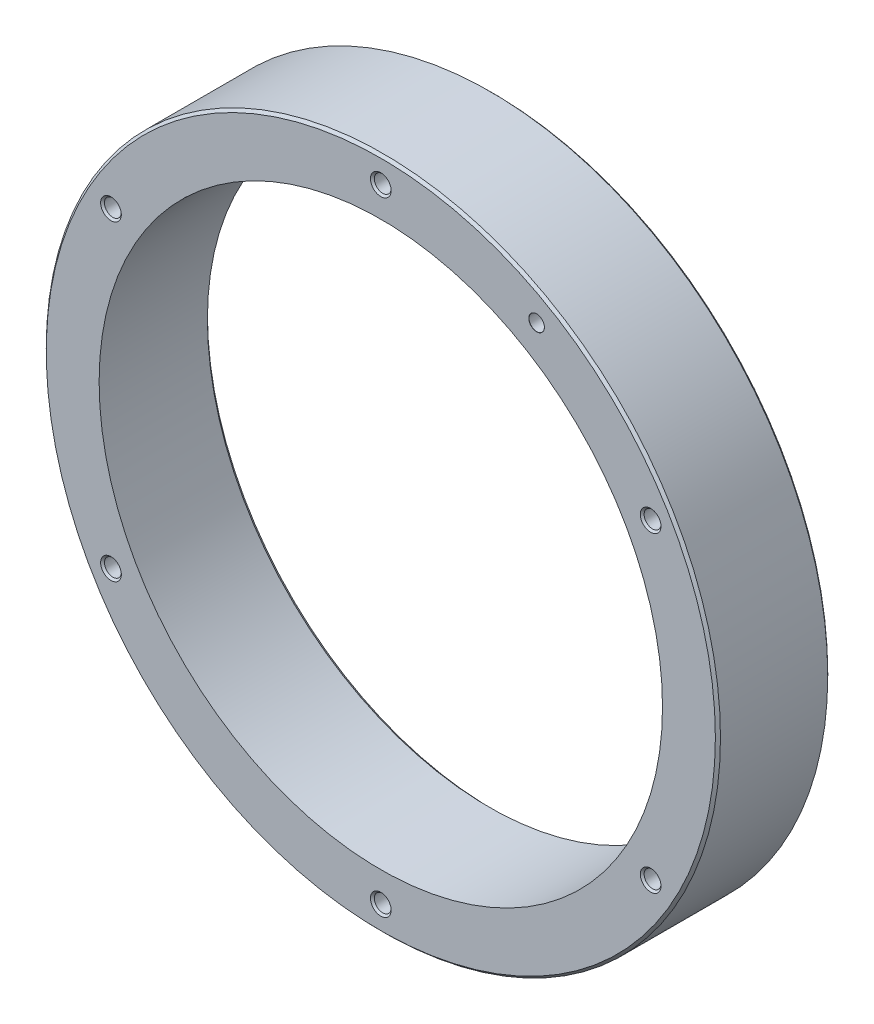
ISO-10303-21;
HEADER;
FILE_DESCRIPTION(('STEP AP214'),'2;1');
FILE_NAME('part.step','',(''),(''),'','','');
FILE_SCHEMA(('AUTOMOTIVE_DESIGN { 1 0 10303 214 1 1 1 1 }'));
ENDSEC;
DATA;
#1=APPLICATION_CONTEXT('core data for automotive mechanical design processes');
#2=APPLICATION_PROTOCOL_DEFINITION('international standard','automotive_design',2000,#1);
#3=PRODUCT_CONTEXT('',#1,'mechanical');
#4=PRODUCT('Part','Part','',(#3));
#5=PRODUCT_RELATED_PRODUCT_CATEGORY('part','',(#4));
#6=PRODUCT_DEFINITION_FORMATION('','',#4);
#7=PRODUCT_DEFINITION_CONTEXT('part definition',#1,'design');
#8=PRODUCT_DEFINITION('design','',#6,#7);
#9=PRODUCT_DEFINITION_SHAPE('','',#8);
#10=(LENGTH_UNIT() NAMED_UNIT(*) SI_UNIT(.MILLI.,.METRE.));
#11=(NAMED_UNIT(*) PLANE_ANGLE_UNIT() SI_UNIT($,.RADIAN.));
#12=(NAMED_UNIT(*) SI_UNIT($,.STERADIAN.) SOLID_ANGLE_UNIT());
#13=UNCERTAINTY_MEASURE_WITH_UNIT(LENGTH_MEASURE(1.E-05),#10,'distance_accuracy_value','');
#14=(GEOMETRIC_REPRESENTATION_CONTEXT(3) GLOBAL_UNCERTAINTY_ASSIGNED_CONTEXT((#13)) GLOBAL_UNIT_ASSIGNED_CONTEXT((#10,
#11,#12)) REPRESENTATION_CONTEXT('',''));
#15=CARTESIAN_POINT('',(0.,0.,0.));
#16=DIRECTION('',(0.,0.,1.));
#17=DIRECTION('',(1.,0.,0.));
#18=AXIS2_PLACEMENT_3D('',#15,#16,#17);
#19=CARTESIAN_POINT('',(0.,0.,-22.));
#20=DIRECTION('',(0.,0.,1.));
#21=DIRECTION('',(1.,0.,0.));
#22=AXIS2_PLACEMENT_3D('',#19,#20,#21);
#23=CYLINDRICAL_SURFACE('',#22,66.);
#24=CARTESIAN_POINT('',(0.,0.,-21.5));
#25=DIRECTION('',(0.,0.,1.));
#26=DIRECTION('',(1.,0.,0.));
#27=AXIS2_PLACEMENT_3D('',#24,#25,#26);
#28=CIRCLE('',#27,66.);
#29=CARTESIAN_POINT('',(66.,0.,-21.5));
#30=VERTEX_POINT('',#29);
#31=EDGE_CURVE('E153',#30,#30,#28,.T.);
#32=ORIENTED_EDGE('',*,*,#31,.T.);
#33=EDGE_LOOP('',(#32));
#34=FACE_BOUND('',#33,.T.);
#35=CARTESIAN_POINT('',(0.,0.,-0.500000000000056));
#36=DIRECTION('',(0.,0.,1.));
#37=DIRECTION('',(1.,0.,0.));
#38=AXIS2_PLACEMENT_3D('',#35,#36,#37);
#39=CIRCLE('',#38,66.);
#40=CARTESIAN_POINT('',(66.,0.,-0.500000000000056));
#41=VERTEX_POINT('',#40);
#42=EDGE_CURVE('E150',#41,#41,#39,.F.);
#43=ORIENTED_EDGE('',*,*,#42,.T.);
#44=EDGE_LOOP('',(#43));
#45=FACE_BOUND('',#44,.T.);
#46=ADVANCED_FACE('F45',(#34,#45),#23,.T.);
#47=CARTESIAN_POINT('',(0.,0.,-22.));
#48=DIRECTION('',(0.,0.,1.));
#49=DIRECTION('',(1.,0.,0.));
#50=AXIS2_PLACEMENT_3D('',#47,#48,#49);
#51=PLANE('',#50);
#52=CARTESIAN_POINT('',(0.,0.,-22.));
#53=DIRECTION('',(0.,0.,1.));
#54=DIRECTION('',(1.,0.,0.));
#55=AXIS2_PLACEMENT_3D('',#52,#53,#54);
#56=CIRCLE('',#55,55.95);
#57=CARTESIAN_POINT('',(55.95,0.,-22.));
#58=VERTEX_POINT('',#57);
#59=EDGE_CURVE('E54',#58,#58,#56,.T.);
#60=ORIENTED_EDGE('',*,*,#59,.T.);
#61=EDGE_LOOP('',(#60));
#62=FACE_BOUND('',#61,.T.);
#63=CARTESIAN_POINT('',(0.,0.,-22.));
#64=DIRECTION('',(0.,0.,1.));
#65=DIRECTION('',(1.,0.,0.));
#66=AXIS2_PLACEMENT_3D('',#63,#64,#65);
#67=CIRCLE('',#66,65.5);
#68=CARTESIAN_POINT('',(65.5,0.,-22.));
#69=VERTEX_POINT('',#68);
#70=EDGE_CURVE('E156',#69,#69,#67,.F.);
#71=ORIENTED_EDGE('',*,*,#70,.T.);
#72=EDGE_LOOP('',(#71));
#73=FACE_BOUND('',#72,.T.);
#74=ADVANCED_FACE('F164',(#62,#73),#51,.F.);
#75=CARTESIAN_POINT('',(0.,0.,0.));
#76=DIRECTION('',(0.,0.,1.));
#77=DIRECTION('',(1.,0.,0.));
#78=AXIS2_PLACEMENT_3D('',#75,#76,#77);
#79=PLANE('',#78);
#80=CARTESIAN_POINT('',(0.,0.,0.));
#81=DIRECTION('',(0.,0.,1.));
#82=DIRECTION('',(1.,0.,0.));
#83=AXIS2_PLACEMENT_3D('',#80,#81,#82);
#84=CIRCLE('',#83,65.4999999999999);
#85=CARTESIAN_POINT('',(65.4999999999999,0.,0.));
#86=VERTEX_POINT('',#85);
#87=EDGE_CURVE('E159',#86,#86,#84,.T.);
#88=ORIENTED_EDGE('',*,*,#87,.T.);
#89=EDGE_LOOP('',(#88));
#90=FACE_BOUND('',#89,.T.);
#91=CARTESIAN_POINT('',(30.5000000000001,52.8275496308507,0.));
#92=DIRECTION('',(0.,0.,1.));
#93=DIRECTION('',(1.,0.,0.));
#94=AXIS2_PLACEMENT_3D('',#91,#92,#93);
#95=CIRCLE('',#94,1.525);
#96=CARTESIAN_POINT('',(32.0250000000001,52.8275496308507,0.));
#97=VERTEX_POINT('',#96);
#98=EDGE_CURVE('E93',#97,#97,#95,.T.);
#99=ORIENTED_EDGE('',*,*,#98,.F.);
#100=EDGE_LOOP('',(#99));
#101=FACE_BOUND('',#100,.T.);
#102=CARTESIAN_POINT('',(52.8275496308504,30.5000000000006,0.));
#103=DIRECTION('',(0.,0.,1.));
#104=DIRECTION('',(1.,0.,0.));
#105=AXIS2_PLACEMENT_3D('',#102,#103,#104);
#106=CIRCLE('',#105,2.025);
#107=CARTESIAN_POINT('',(54.8525496308504,30.5000000000006,0.));
#108=VERTEX_POINT('',#107);
#109=EDGE_CURVE('E86',#108,#108,#106,.T.);
#110=ORIENTED_EDGE('',*,*,#109,.F.);
#111=EDGE_LOOP('',(#110));
#112=FACE_BOUND('',#111,.T.);
#113=CARTESIAN_POINT('',(52.827549630851,-30.4999999999995,0.));
#114=DIRECTION('',(0.,0.,1.));
#115=DIRECTION('',(1.,0.,0.));
#116=AXIS2_PLACEMENT_3D('',#113,#114,#115);
#117=CIRCLE('',#116,2.025);
#118=CARTESIAN_POINT('',(54.852549630851,-30.4999999999995,0.));
#119=VERTEX_POINT('',#118);
#120=EDGE_CURVE('E102',#119,#119,#117,.T.);
#121=ORIENTED_EDGE('',*,*,#120,.F.);
#122=EDGE_LOOP('',(#121));
#123=FACE_BOUND('',#122,.T.);
#124=CARTESIAN_POINT('',(0.,-61.,0.));
#125=DIRECTION('',(0.,0.,1.));
#126=DIRECTION('',(1.,0.,0.));
#127=AXIS2_PLACEMENT_3D('',#124,#125,#126);
#128=CIRCLE('',#127,2.025);
#129=CARTESIAN_POINT('',(2.025,-61.,0.));
#130=VERTEX_POINT('',#129);
#131=EDGE_CURVE('E111',#130,#130,#128,.T.);
#132=ORIENTED_EDGE('',*,*,#131,.F.);
#133=EDGE_LOOP('',(#132));
#134=FACE_BOUND('',#133,.T.);
#135=CARTESIAN_POINT('',(-52.8275496308506,-30.5000000000002,0.));
#136=DIRECTION('',(0.,0.,1.));
#137=DIRECTION('',(1.,0.,0.));
#138=AXIS2_PLACEMENT_3D('',#135,#136,#137);
#139=CIRCLE('',#138,2.025);
#140=CARTESIAN_POINT('',(-50.8025496308506,-30.5000000000002,0.));
#141=VERTEX_POINT('',#140);
#142=EDGE_CURVE('E120',#141,#141,#139,.T.);
#143=ORIENTED_EDGE('',*,*,#142,.F.);
#144=EDGE_LOOP('',(#143));
#145=FACE_BOUND('',#144,.T.);
#146=CARTESIAN_POINT('',(-52.8275496308508,30.4999999999999,0.));
#147=DIRECTION('',(0.,0.,1.));
#148=DIRECTION('',(1.,0.,0.));
#149=AXIS2_PLACEMENT_3D('',#146,#147,#148);
#150=CIRCLE('',#149,2.025);
#151=CARTESIAN_POINT('',(-50.8025496308508,30.4999999999999,0.));
#152=VERTEX_POINT('',#151);
#153=EDGE_CURVE('E129',#152,#152,#150,.T.);
#154=ORIENTED_EDGE('',*,*,#153,.F.);
#155=EDGE_LOOP('',(#154));
#156=FACE_BOUND('',#155,.T.);
#157=CARTESIAN_POINT('',(0.,61.,0.));
#158=DIRECTION('',(0.,0.,1.));
#159=DIRECTION('',(1.,0.,0.));
#160=AXIS2_PLACEMENT_3D('',#157,#158,#159);
#161=CIRCLE('',#160,2.025);
#162=CARTESIAN_POINT('',(2.025,61.,0.));
#163=VERTEX_POINT('',#162);
#164=EDGE_CURVE('E138',#163,#163,#161,.T.);
#165=ORIENTED_EDGE('',*,*,#164,.F.);
#166=EDGE_LOOP('',(#165));
#167=FACE_BOUND('',#166,.T.);
#168=CARTESIAN_POINT('',(0.,0.,0.));
#169=DIRECTION('',(0.,0.,1.));
#170=DIRECTION('',(1.,0.,0.));
#171=AXIS2_PLACEMENT_3D('',#168,#169,#170);
#172=CIRCLE('',#171,55.15);
#173=CARTESIAN_POINT('',(55.15,0.,0.));
#174=VERTEX_POINT('',#173);
#175=EDGE_CURVE('E147',#174,#174,#172,.T.);
#176=ORIENTED_EDGE('',*,*,#175,.F.);
#177=EDGE_LOOP('',(#176));
#178=FACE_BOUND('',#177,.T.);
#179=ADVANCED_FACE('F185',(#90,#101,#112,#123,#134,#145,#156,#167,#178),#79,.T.);
#180=CARTESIAN_POINT('',(0.,0.,-22.));
#181=DIRECTION('',(0.,0.,1.));
#182=DIRECTION('',(1.,0.,0.));
#183=AXIS2_PLACEMENT_3D('',#180,#181,#182);
#184=CYLINDRICAL_SURFACE('',#183,55.15);
#185=CARTESIAN_POINT('',(0.,0.,-21.2));
#186=DIRECTION('',(0.,0.,1.));
#187=DIRECTION('',(1.,0.,0.));
#188=AXIS2_PLACEMENT_3D('',#185,#186,#187);
#189=CIRCLE('',#188,55.15);
#190=CARTESIAN_POINT('',(55.15,0.,-21.2));
#191=VERTEX_POINT('',#190);
#192=EDGE_CURVE('E11',#191,#191,#189,.F.);
#193=ORIENTED_EDGE('',*,*,#192,.T.);
#194=EDGE_LOOP('',(#193));
#195=FACE_BOUND('',#194,.T.);
#196=ORIENTED_EDGE('',*,*,#175,.T.);
#197=EDGE_LOOP('',(#196));
#198=FACE_BOUND('',#197,.T.);
#199=ADVANCED_FACE('F284',(#195,#198),#184,.F.);
#200=CARTESIAN_POINT('',(0.,61.,-11.));
#201=DIRECTION('',(0.,0.,1.));
#202=DIRECTION('',(1.,0.,0.));
#203=AXIS2_PLACEMENT_3D('',#200,#201,#202);
#204=CONICAL_SURFACE('',#203,1.65,1.02974425867665);
#205=CARTESIAN_POINT('',(0.,61.,-11.9914200213955));
#206=VERTEX_POINT('',#205);
#207=VERTEX_LOOP('',#206);
#208=FACE_BOUND('',#207,.T.);
#209=CARTESIAN_POINT('',(0.,61.,-11.));
#210=DIRECTION('',(0.,0.,1.));
#211=DIRECTION('',(1.,0.,0.));
#212=AXIS2_PLACEMENT_3D('',#209,#210,#211);
#213=CIRCLE('',#212,1.65);
#214=CARTESIAN_POINT('',(1.65,61.,-11.));
#215=VERTEX_POINT('',#214);
#216=EDGE_CURVE('E144',#215,#215,#213,.T.);
#217=ORIENTED_EDGE('',*,*,#216,.T.);
#218=EDGE_LOOP('',(#217));
#219=FACE_BOUND('',#218,.T.);
#220=ADVANCED_FACE('F280',(#208,#219),#204,.F.);
#221=CARTESIAN_POINT('',(0.,61.,0.));
#222=DIRECTION('',(0.,0.,1.));
#223=DIRECTION('',(1.,0.,0.));
#224=AXIS2_PLACEMENT_3D('',#221,#222,#223);
#225=CYLINDRICAL_SURFACE('',#224,1.65);
#226=ORIENTED_EDGE('',*,*,#216,.F.);
#227=EDGE_LOOP('',(#226));
#228=FACE_BOUND('',#227,.T.);
#229=CARTESIAN_POINT('',(0.,61.,-0.375));
#230=DIRECTION('',(0.,0.,1.));
#231=DIRECTION('',(1.,0.,0.));
#232=AXIS2_PLACEMENT_3D('',#229,#230,#231);
#233=CIRCLE('',#232,1.65);
#234=CARTESIAN_POINT('',(1.65,61.,-0.375));
#235=VERTEX_POINT('',#234);
#236=EDGE_CURVE('E141',#235,#235,#233,.T.);
#237=ORIENTED_EDGE('',*,*,#236,.T.);
#238=EDGE_LOOP('',(#237));
#239=FACE_BOUND('',#238,.T.);
#240=ADVANCED_FACE('F276',(#228,#239),#225,.F.);
#241=CARTESIAN_POINT('',(0.,61.,0.));
#242=DIRECTION('',(0.,0.,1.));
#243=DIRECTION('',(1.,0.,0.));
#244=AXIS2_PLACEMENT_3D('',#241,#242,#243);
#245=CONICAL_SURFACE('',#244,2.025,0.785398163397446);
#246=ORIENTED_EDGE('',*,*,#236,.F.);
#247=EDGE_LOOP('',(#246));
#248=FACE_BOUND('',#247,.T.);
#249=ORIENTED_EDGE('',*,*,#164,.T.);
#250=EDGE_LOOP('',(#249));
#251=FACE_BOUND('',#250,.T.);
#252=ADVANCED_FACE('F273',(#248,#251),#245,.F.);
#253=CARTESIAN_POINT('',(-52.8275496308508,30.4999999999999,-11.));
#254=DIRECTION('',(0.,0.,1.));
#255=DIRECTION('',(1.,0.,0.));
#256=AXIS2_PLACEMENT_3D('',#253,#254,#255);
#257=CONICAL_SURFACE('',#256,1.65,1.02974425867665);
#258=CARTESIAN_POINT('',(-52.8275496308508,30.4999999999999,-11.9914200213955));
#259=VERTEX_POINT('',#258);
#260=VERTEX_LOOP('',#259);
#261=FACE_BOUND('',#260,.T.);
#262=CARTESIAN_POINT('',(-52.8275496308508,30.4999999999999,-11.));
#263=DIRECTION('',(0.,0.,1.));
#264=DIRECTION('',(1.,0.,0.));
#265=AXIS2_PLACEMENT_3D('',#262,#263,#264);
#266=CIRCLE('',#265,1.65);
#267=CARTESIAN_POINT('',(-51.1775496308508,30.4999999999999,-11.));
#268=VERTEX_POINT('',#267);
#269=EDGE_CURVE('E135',#268,#268,#266,.T.);
#270=ORIENTED_EDGE('',*,*,#269,.T.);
#271=EDGE_LOOP('',(#270));
#272=FACE_BOUND('',#271,.T.);
#273=ADVANCED_FACE('F269',(#261,#272),#257,.F.);
#274=CARTESIAN_POINT('',(-52.8275496308508,30.4999999999999,0.));
#275=DIRECTION('',(0.,0.,1.));
#276=DIRECTION('',(1.,0.,0.));
#277=AXIS2_PLACEMENT_3D('',#274,#275,#276);
#278=CYLINDRICAL_SURFACE('',#277,1.65);
#279=ORIENTED_EDGE('',*,*,#269,.F.);
#280=EDGE_LOOP('',(#279));
#281=FACE_BOUND('',#280,.T.);
#282=CARTESIAN_POINT('',(-52.8275496308508,30.4999999999999,-0.375));
#283=DIRECTION('',(0.,0.,1.));
#284=DIRECTION('',(1.,0.,0.));
#285=AXIS2_PLACEMENT_3D('',#282,#283,#284);
#286=CIRCLE('',#285,1.65);
#287=CARTESIAN_POINT('',(-51.1775496308508,30.4999999999999,-0.375));
#288=VERTEX_POINT('',#287);
#289=EDGE_CURVE('E132',#288,#288,#286,.T.);
#290=ORIENTED_EDGE('',*,*,#289,.T.);
#291=EDGE_LOOP('',(#290));
#292=FACE_BOUND('',#291,.T.);
#293=ADVANCED_FACE('F265',(#281,#292),#278,.F.);
#294=CARTESIAN_POINT('',(-52.8275496308508,30.4999999999999,0.));
#295=DIRECTION('',(0.,0.,1.));
#296=DIRECTION('',(1.,0.,0.));
#297=AXIS2_PLACEMENT_3D('',#294,#295,#296);
#298=CONICAL_SURFACE('',#297,2.025,0.785398163397446);
#299=ORIENTED_EDGE('',*,*,#289,.F.);
#300=EDGE_LOOP('',(#299));
#301=FACE_BOUND('',#300,.T.);
#302=ORIENTED_EDGE('',*,*,#153,.T.);
#303=EDGE_LOOP('',(#302));
#304=FACE_BOUND('',#303,.T.);
#305=ADVANCED_FACE('F261',(#301,#304),#298,.F.);
#306=CARTESIAN_POINT('',(-52.8275496308506,-30.5000000000002,-11.));
#307=DIRECTION('',(0.,0.,1.));
#308=DIRECTION('',(1.,0.,0.));
#309=AXIS2_PLACEMENT_3D('',#306,#307,#308);
#310=CONICAL_SURFACE('',#309,1.65,1.02974425867665);
#311=CARTESIAN_POINT('',(-52.8275496308506,-30.5000000000002,-11.9914200213955));
#312=VERTEX_POINT('',#311);
#313=VERTEX_LOOP('',#312);
#314=FACE_BOUND('',#313,.T.);
#315=CARTESIAN_POINT('',(-52.8275496308506,-30.5000000000002,-11.));
#316=DIRECTION('',(0.,0.,1.));
#317=DIRECTION('',(1.,0.,0.));
#318=AXIS2_PLACEMENT_3D('',#315,#316,#317);
#319=CIRCLE('',#318,1.65);
#320=CARTESIAN_POINT('',(-51.1775496308506,-30.5000000000002,-11.));
#321=VERTEX_POINT('',#320);
#322=EDGE_CURVE('E126',#321,#321,#319,.T.);
#323=ORIENTED_EDGE('',*,*,#322,.T.);
#324=EDGE_LOOP('',(#323));
#325=FACE_BOUND('',#324,.T.);
#326=ADVANCED_FACE('F257',(#314,#325),#310,.F.);
#327=CARTESIAN_POINT('',(-52.8275496308506,-30.5000000000002,0.));
#328=DIRECTION('',(0.,0.,1.));
#329=DIRECTION('',(1.,0.,0.));
#330=AXIS2_PLACEMENT_3D('',#327,#328,#329);
#331=CYLINDRICAL_SURFACE('',#330,1.65);
#332=ORIENTED_EDGE('',*,*,#322,.F.);
#333=EDGE_LOOP('',(#332));
#334=FACE_BOUND('',#333,.T.);
#335=CARTESIAN_POINT('',(-52.8275496308506,-30.5000000000002,-0.375));
#336=DIRECTION('',(0.,0.,1.));
#337=DIRECTION('',(1.,0.,0.));
#338=AXIS2_PLACEMENT_3D('',#335,#336,#337);
#339=CIRCLE('',#338,1.65);
#340=CARTESIAN_POINT('',(-51.1775496308506,-30.5000000000002,-0.375));
#341=VERTEX_POINT('',#340);
#342=EDGE_CURVE('E123',#341,#341,#339,.T.);
#343=ORIENTED_EDGE('',*,*,#342,.T.);
#344=EDGE_LOOP('',(#343));
#345=FACE_BOUND('',#344,.T.);
#346=ADVANCED_FACE('F253',(#334,#345),#331,.F.);
#347=CARTESIAN_POINT('',(-52.8275496308506,-30.5000000000002,0.));
#348=DIRECTION('',(0.,0.,1.));
#349=DIRECTION('',(1.,0.,0.));
#350=AXIS2_PLACEMENT_3D('',#347,#348,#349);
#351=CONICAL_SURFACE('',#350,2.025,0.785398163397446);
#352=ORIENTED_EDGE('',*,*,#342,.F.);
#353=EDGE_LOOP('',(#352));
#354=FACE_BOUND('',#353,.T.);
#355=ORIENTED_EDGE('',*,*,#142,.T.);
#356=EDGE_LOOP('',(#355));
#357=FACE_BOUND('',#356,.T.);
#358=ADVANCED_FACE('F249',(#354,#357),#351,.F.);
#359=CARTESIAN_POINT('',(0.,-61.,-11.));
#360=DIRECTION('',(0.,0.,1.));
#361=DIRECTION('',(1.,0.,0.));
#362=AXIS2_PLACEMENT_3D('',#359,#360,#361);
#363=CONICAL_SURFACE('',#362,1.65,1.02974425867665);
#364=CARTESIAN_POINT('',(0.,-61.,-11.9914200213955));
#365=VERTEX_POINT('',#364);
#366=VERTEX_LOOP('',#365);
#367=FACE_BOUND('',#366,.T.);
#368=CARTESIAN_POINT('',(0.,-61.,-11.));
#369=DIRECTION('',(0.,0.,1.));
#370=DIRECTION('',(1.,0.,0.));
#371=AXIS2_PLACEMENT_3D('',#368,#369,#370);
#372=CIRCLE('',#371,1.65);
#373=CARTESIAN_POINT('',(1.65,-61.,-11.));
#374=VERTEX_POINT('',#373);
#375=EDGE_CURVE('E117',#374,#374,#372,.T.);
#376=ORIENTED_EDGE('',*,*,#375,.T.);
#377=EDGE_LOOP('',(#376));
#378=FACE_BOUND('',#377,.T.);
#379=ADVANCED_FACE('F245',(#367,#378),#363,.F.);
#380=CARTESIAN_POINT('',(0.,-61.,0.));
#381=DIRECTION('',(0.,0.,1.));
#382=DIRECTION('',(1.,0.,0.));
#383=AXIS2_PLACEMENT_3D('',#380,#381,#382);
#384=CYLINDRICAL_SURFACE('',#383,1.65);
#385=ORIENTED_EDGE('',*,*,#375,.F.);
#386=EDGE_LOOP('',(#385));
#387=FACE_BOUND('',#386,.T.);
#388=CARTESIAN_POINT('',(0.,-61.,-0.375));
#389=DIRECTION('',(0.,0.,1.));
#390=DIRECTION('',(1.,0.,0.));
#391=AXIS2_PLACEMENT_3D('',#388,#389,#390);
#392=CIRCLE('',#391,1.65);
#393=CARTESIAN_POINT('',(1.65,-61.,-0.375));
#394=VERTEX_POINT('',#393);
#395=EDGE_CURVE('E114',#394,#394,#392,.T.);
#396=ORIENTED_EDGE('',*,*,#395,.T.);
#397=EDGE_LOOP('',(#396));
#398=FACE_BOUND('',#397,.T.);
#399=ADVANCED_FACE('F241',(#387,#398),#384,.F.);
#400=CARTESIAN_POINT('',(0.,-61.,0.));
#401=DIRECTION('',(0.,0.,1.));
#402=DIRECTION('',(1.,0.,0.));
#403=AXIS2_PLACEMENT_3D('',#400,#401,#402);
#404=CONICAL_SURFACE('',#403,2.025,0.785398163397446);
#405=ORIENTED_EDGE('',*,*,#395,.F.);
#406=EDGE_LOOP('',(#405));
#407=FACE_BOUND('',#406,.T.);
#408=ORIENTED_EDGE('',*,*,#131,.T.);
#409=EDGE_LOOP('',(#408));
#410=FACE_BOUND('',#409,.T.);
#411=ADVANCED_FACE('F237',(#407,#410),#404,.F.);
#412=CARTESIAN_POINT('',(52.827549630851,-30.4999999999995,-11.));
#413=DIRECTION('',(0.,0.,1.));
#414=DIRECTION('',(1.,0.,0.));
#415=AXIS2_PLACEMENT_3D('',#412,#413,#414);
#416=CONICAL_SURFACE('',#415,1.65,1.02974425867665);
#417=CARTESIAN_POINT('',(52.827549630851,-30.4999999999995,-11.9914200213955));
#418=VERTEX_POINT('',#417);
#419=VERTEX_LOOP('',#418);
#420=FACE_BOUND('',#419,.T.);
#421=CARTESIAN_POINT('',(52.827549630851,-30.4999999999995,-11.));
#422=DIRECTION('',(0.,0.,1.));
#423=DIRECTION('',(1.,0.,0.));
#424=AXIS2_PLACEMENT_3D('',#421,#422,#423);
#425=CIRCLE('',#424,1.65);
#426=CARTESIAN_POINT('',(54.477549630851,-30.4999999999995,-11.));
#427=VERTEX_POINT('',#426);
#428=EDGE_CURVE('E108',#427,#427,#425,.T.);
#429=ORIENTED_EDGE('',*,*,#428,.T.);
#430=EDGE_LOOP('',(#429));
#431=FACE_BOUND('',#430,.T.);
#432=ADVANCED_FACE('F233',(#420,#431),#416,.F.);
#433=CARTESIAN_POINT('',(52.827549630851,-30.4999999999995,0.));
#434=DIRECTION('',(0.,0.,1.));
#435=DIRECTION('',(1.,0.,0.));
#436=AXIS2_PLACEMENT_3D('',#433,#434,#435);
#437=CYLINDRICAL_SURFACE('',#436,1.65);
#438=ORIENTED_EDGE('',*,*,#428,.F.);
#439=EDGE_LOOP('',(#438));
#440=FACE_BOUND('',#439,.T.);
#441=CARTESIAN_POINT('',(52.827549630851,-30.4999999999995,-0.375));
#442=DIRECTION('',(0.,0.,1.));
#443=DIRECTION('',(1.,0.,0.));
#444=AXIS2_PLACEMENT_3D('',#441,#442,#443);
#445=CIRCLE('',#444,1.65);
#446=CARTESIAN_POINT('',(54.477549630851,-30.4999999999995,-0.375));
#447=VERTEX_POINT('',#446);
#448=EDGE_CURVE('E105',#447,#447,#445,.T.);
#449=ORIENTED_EDGE('',*,*,#448,.T.);
#450=EDGE_LOOP('',(#449));
#451=FACE_BOUND('',#450,.T.);
#452=ADVANCED_FACE('F229',(#440,#451),#437,.F.);
#453=CARTESIAN_POINT('',(52.827549630851,-30.4999999999995,0.));
#454=DIRECTION('',(0.,0.,1.));
#455=DIRECTION('',(1.,0.,0.));
#456=AXIS2_PLACEMENT_3D('',#453,#454,#455);
#457=CONICAL_SURFACE('',#456,2.025,0.785398163397446);
#458=ORIENTED_EDGE('',*,*,#448,.F.);
#459=EDGE_LOOP('',(#458));
#460=FACE_BOUND('',#459,.T.);
#461=ORIENTED_EDGE('',*,*,#120,.T.);
#462=EDGE_LOOP('',(#461));
#463=FACE_BOUND('',#462,.T.);
#464=ADVANCED_FACE('F225',(#460,#463),#457,.F.);
#465=CARTESIAN_POINT('',(52.8275496308504,30.5000000000006,-11.));
#466=DIRECTION('',(0.,0.,1.));
#467=DIRECTION('',(1.,0.,0.));
#468=AXIS2_PLACEMENT_3D('',#465,#466,#467);
#469=CONICAL_SURFACE('',#468,1.65,1.02974425867665);
#470=CARTESIAN_POINT('',(52.8275496308504,30.5000000000006,-11.9914200213955));
#471=VERTEX_POINT('',#470);
#472=VERTEX_LOOP('',#471);
#473=FACE_BOUND('',#472,.T.);
#474=CARTESIAN_POINT('',(52.8275496308504,30.5000000000006,-11.));
#475=DIRECTION('',(0.,0.,1.));
#476=DIRECTION('',(1.,0.,0.));
#477=AXIS2_PLACEMENT_3D('',#474,#475,#476);
#478=CIRCLE('',#477,1.65);
#479=CARTESIAN_POINT('',(54.4775496308504,30.5000000000006,-11.));
#480=VERTEX_POINT('',#479);
#481=EDGE_CURVE('E99',#480,#480,#478,.T.);
#482=ORIENTED_EDGE('',*,*,#481,.T.);
#483=EDGE_LOOP('',(#482));
#484=FACE_BOUND('',#483,.T.);
#485=ADVANCED_FACE('F221',(#473,#484),#469,.F.);
#486=CARTESIAN_POINT('',(52.8275496308504,30.5000000000006,0.));
#487=DIRECTION('',(0.,0.,1.));
#488=DIRECTION('',(1.,0.,0.));
#489=AXIS2_PLACEMENT_3D('',#486,#487,#488);
#490=CYLINDRICAL_SURFACE('',#489,1.65);
#491=ORIENTED_EDGE('',*,*,#481,.F.);
#492=EDGE_LOOP('',(#491));
#493=FACE_BOUND('',#492,.T.);
#494=CARTESIAN_POINT('',(52.8275496308504,30.5000000000006,-0.375));
#495=DIRECTION('',(0.,0.,1.));
#496=DIRECTION('',(1.,0.,0.));
#497=AXIS2_PLACEMENT_3D('',#494,#495,#496);
#498=CIRCLE('',#497,1.65);
#499=CARTESIAN_POINT('',(54.4775496308504,30.5000000000006,-0.375));
#500=VERTEX_POINT('',#499);
#501=EDGE_CURVE('E90',#500,#500,#498,.T.);
#502=ORIENTED_EDGE('',*,*,#501,.T.);
#503=EDGE_LOOP('',(#502));
#504=FACE_BOUND('',#503,.T.);
#505=ADVANCED_FACE('F217',(#493,#504),#490,.F.);
#506=CARTESIAN_POINT('',(52.8275496308504,30.5000000000006,0.));
#507=DIRECTION('',(0.,0.,1.));
#508=DIRECTION('',(1.,0.,0.));
#509=AXIS2_PLACEMENT_3D('',#506,#507,#508);
#510=CONICAL_SURFACE('',#509,2.025,0.785398163397446);
#511=ORIENTED_EDGE('',*,*,#501,.F.);
#512=EDGE_LOOP('',(#511));
#513=FACE_BOUND('',#512,.T.);
#514=ORIENTED_EDGE('',*,*,#109,.T.);
#515=EDGE_LOOP('',(#514));
#516=FACE_BOUND('',#515,.T.);
#517=ADVANCED_FACE('F80',(#513,#516),#510,.F.);
#518=CARTESIAN_POINT('',(30.5000000000001,52.8275496308507,-7.));
#519=DIRECTION('',(0.,0.,1.));
#520=DIRECTION('',(1.,0.,0.));
#521=AXIS2_PLACEMENT_3D('',#518,#519,#520);
#522=CONICAL_SURFACE('',#521,1.5,1.02974425867665);
#523=CARTESIAN_POINT('',(30.5000000000001,52.8275496308507,-7.90129092854134));
#524=VERTEX_POINT('',#523);
#525=VERTEX_LOOP('',#524);
#526=FACE_BOUND('',#525,.T.);
#527=CARTESIAN_POINT('',(30.5000000000001,52.8275496308507,-7.));
#528=DIRECTION('',(0.,0.,1.));
#529=DIRECTION('',(1.,0.,0.));
#530=AXIS2_PLACEMENT_3D('',#527,#528,#529);
#531=CIRCLE('',#530,1.5);
#532=CARTESIAN_POINT('',(32.0000000000001,52.8275496308507,-7.));
#533=VERTEX_POINT('',#532);
#534=EDGE_CURVE('E84',#533,#533,#531,.T.);
#535=ORIENTED_EDGE('',*,*,#534,.T.);
#536=EDGE_LOOP('',(#535));
#537=FACE_BOUND('',#536,.T.);
#538=ADVANCED_FACE('F76',(#526,#537),#522,.F.);
#539=CARTESIAN_POINT('',(30.5000000000001,52.8275496308507,0.));
#540=DIRECTION('',(0.,0.,1.));
#541=DIRECTION('',(1.,0.,0.));
#542=AXIS2_PLACEMENT_3D('',#539,#540,#541);
#543=CYLINDRICAL_SURFACE('',#542,1.5);
#544=ORIENTED_EDGE('',*,*,#534,.F.);
#545=EDGE_LOOP('',(#544));
#546=FACE_BOUND('',#545,.T.);
#547=CARTESIAN_POINT('',(30.5000000000001,52.8275496308507,-0.0250000000000016));
#548=DIRECTION('',(0.,0.,1.));
#549=DIRECTION('',(1.,0.,0.));
#550=AXIS2_PLACEMENT_3D('',#547,#548,#549);
#551=CIRCLE('',#550,1.5);
#552=CARTESIAN_POINT('',(32.0000000000001,52.8275496308507,-0.0250000000000016));
#553=VERTEX_POINT('',#552);
#554=EDGE_CURVE('E87',#553,#553,#551,.T.);
#555=ORIENTED_EDGE('',*,*,#554,.T.);
#556=EDGE_LOOP('',(#555));
#557=FACE_BOUND('',#556,.T.);
#558=ADVANCED_FACE('F79',(#546,#557),#543,.F.);
#559=CARTESIAN_POINT('',(30.5000000000001,52.8275496308507,0.));
#560=DIRECTION('',(0.,0.,1.));
#561=DIRECTION('',(1.,0.,0.));
#562=AXIS2_PLACEMENT_3D('',#559,#560,#561);
#563=CONICAL_SURFACE('',#562,1.525,0.785398163397362);
#564=ORIENTED_EDGE('',*,*,#554,.F.);
#565=EDGE_LOOP('',(#564));
#566=FACE_BOUND('',#565,.T.);
#567=ORIENTED_EDGE('',*,*,#98,.T.);
#568=EDGE_LOOP('',(#567));
#569=FACE_BOUND('',#568,.T.);
#570=ADVANCED_FACE('F195',(#566,#569),#563,.F.);
#571=CARTESIAN_POINT('',(0.,0.,-21.5));
#572=DIRECTION('',(0.,0.,1.));
#573=DIRECTION('',(1.,0.,0.));
#574=AXIS2_PLACEMENT_3D('',#571,#572,#573);
#575=CONICAL_SURFACE('',#574,66.,0.785398163397435);
#576=ORIENTED_EDGE('',*,*,#70,.F.);
#577=EDGE_LOOP('',(#576));
#578=FACE_BOUND('',#577,.T.);
#579=ORIENTED_EDGE('',*,*,#31,.F.);
#580=EDGE_LOOP('',(#579));
#581=FACE_BOUND('',#580,.T.);
#582=ADVANCED_FACE('F174',(#578,#581),#575,.T.);
#583=CARTESIAN_POINT('',(0.,0.,0.));
#584=DIRECTION('',(0.,0.,-1.));
#585=DIRECTION('',(-1.,0.,0.));
#586=AXIS2_PLACEMENT_3D('',#583,#584,#585);
#587=CONICAL_SURFACE('',#586,65.4999999999999,0.785398163397448);
#588=ORIENTED_EDGE('',*,*,#42,.F.);
#589=EDGE_LOOP('',(#588));
#590=FACE_BOUND('',#589,.T.);
#591=ORIENTED_EDGE('',*,*,#87,.F.);
#592=EDGE_LOOP('',(#591));
#593=FACE_BOUND('',#592,.T.);
#594=ADVANCED_FACE('F168',(#590,#593),#587,.T.);
#595=CARTESIAN_POINT('',(0.,0.,-22.));
#596=DIRECTION('',(0.,0.,-1.));
#597=DIRECTION('',(-1.,0.,0.));
#598=AXIS2_PLACEMENT_3D('',#595,#596,#597);
#599=CONICAL_SURFACE('',#598,55.95,0.785398163397461);
#600=ORIENTED_EDGE('',*,*,#192,.F.);
#601=EDGE_LOOP('',(#600));
#602=FACE_BOUND('',#601,.T.);
#603=ORIENTED_EDGE('',*,*,#59,.F.);
#604=EDGE_LOOP('',(#603));
#605=FACE_BOUND('',#604,.T.);
#606=ADVANCED_FACE('F48',(#602,#605),#599,.F.);
#607=CLOSED_SHELL('',(#46,#74,#179,#199,#220,#240,#252,#273,#293,#305,#326,#346,#358,#379,#399,
#411,#432,#452,#464,#485,#505,#517,#538,#558,#570,#582,#594,#606));
#608=MANIFOLD_SOLID_BREP('B2',#607);
#609=ADVANCED_BREP_SHAPE_REPRESENTATION('',(#18,#608),#14);
#610=SHAPE_DEFINITION_REPRESENTATION(#9,#609);
ENDSEC;
END-ISO-10303-21;
